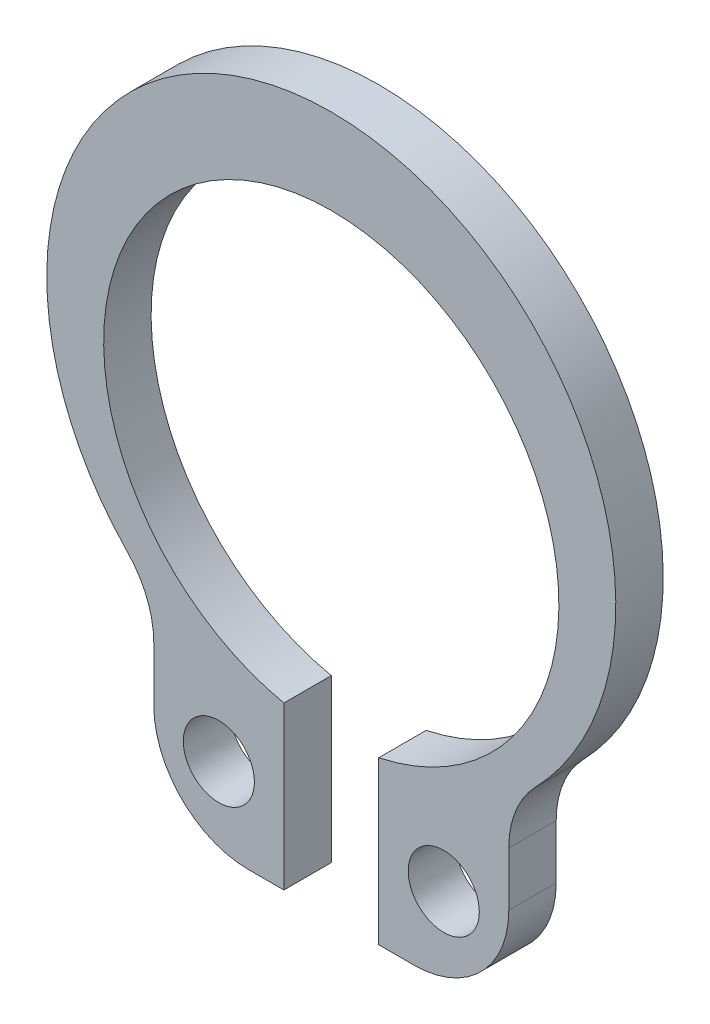
ISO-10303-21;
HEADER;
FILE_DESCRIPTION(('STEP AP214'),'2;1');
FILE_NAME('part.step','',(''),(''),'','','');
FILE_SCHEMA(('AUTOMOTIVE_DESIGN { 1 0 10303 214 1 1 1 1 }'));
ENDSEC;
DATA;
#1=APPLICATION_CONTEXT('core data for automotive mechanical design processes');
#2=APPLICATION_PROTOCOL_DEFINITION('international standard','automotive_design',2000,#1);
#3=PRODUCT_CONTEXT('',#1,'mechanical');
#4=PRODUCT('Part','Part','',(#3));
#5=PRODUCT_RELATED_PRODUCT_CATEGORY('part','',(#4));
#6=PRODUCT_DEFINITION_FORMATION('','',#4);
#7=PRODUCT_DEFINITION_CONTEXT('part definition',#1,'design');
#8=PRODUCT_DEFINITION('design','',#6,#7);
#9=PRODUCT_DEFINITION_SHAPE('','',#8);
#10=(LENGTH_UNIT() NAMED_UNIT(*) SI_UNIT(.MILLI.,.METRE.));
#11=(NAMED_UNIT(*) PLANE_ANGLE_UNIT() SI_UNIT($,.RADIAN.));
#12=(NAMED_UNIT(*) SI_UNIT($,.STERADIAN.) SOLID_ANGLE_UNIT());
#13=UNCERTAINTY_MEASURE_WITH_UNIT(LENGTH_MEASURE(1.E-05),#10,'distance_accuracy_value','');
#14=(GEOMETRIC_REPRESENTATION_CONTEXT(3) GLOBAL_UNCERTAINTY_ASSIGNED_CONTEXT((#13)) GLOBAL_UNIT_ASSIGNED_CONTEXT((#10,
#11,#12)) REPRESENTATION_CONTEXT('',''));
#15=CARTESIAN_POINT('',(0.,0.,0.));
#16=DIRECTION('',(0.,0.,1.));
#17=DIRECTION('',(1.,0.,0.));
#18=AXIS2_PLACEMENT_3D('',#15,#16,#17);
#19=CARTESIAN_POINT('',(-2.37160157380422,-6.45,0.5));
#20=DIRECTION('',(0.,0.,-1.));
#21=DIRECTION('',(1.,0.,0.));
#22=AXIS2_PLACEMENT_3D('',#19,#20,#21);
#23=CYLINDRICAL_SURFACE('',#22,0.75);
#24=CARTESIAN_POINT('',(-2.37160157380422,-6.45,0.));
#25=DIRECTION('',(0.,0.,1.));
#26=DIRECTION('',(1.,0.,0.));
#27=AXIS2_PLACEMENT_3D('',#24,#25,#26);
#28=CIRCLE('',#27,0.75);
#29=CARTESIAN_POINT('',(-1.62160157380422,-6.45,0.));
#30=VERTEX_POINT('',#29);
#31=EDGE_CURVE('E32',#30,#30,#28,.T.);
#32=ORIENTED_EDGE('',*,*,#31,.F.);
#33=EDGE_LOOP('',(#32));
#34=FACE_BOUND('',#33,.T.);
#35=CARTESIAN_POINT('',(-2.37160157380422,-6.45,1.));
#36=DIRECTION('',(0.,0.,-1.));
#37=DIRECTION('',(1.,0.,0.));
#38=AXIS2_PLACEMENT_3D('',#35,#36,#37);
#39=CIRCLE('',#38,0.75);
#40=CARTESIAN_POINT('',(-1.62160157380422,-6.45,1.));
#41=VERTEX_POINT('',#40);
#42=EDGE_CURVE('E204',#41,#41,#39,.T.);
#43=ORIENTED_EDGE('',*,*,#42,.F.);
#44=EDGE_LOOP('',(#43));
#45=FACE_BOUND('',#44,.T.);
#46=ADVANCED_FACE('F15',(#34,#45),#23,.F.);
#47=CARTESIAN_POINT('',(2.37160157380422,-6.45,0.5));
#48=DIRECTION('',(0.,0.,-1.));
#49=DIRECTION('',(1.,0.,0.));
#50=AXIS2_PLACEMENT_3D('',#47,#48,#49);
#51=CYLINDRICAL_SURFACE('',#50,0.75);
#52=CARTESIAN_POINT('',(2.37160157380422,-6.45,0.));
#53=DIRECTION('',(0.,0.,1.));
#54=DIRECTION('',(1.,0.,0.));
#55=AXIS2_PLACEMENT_3D('',#52,#53,#54);
#56=CIRCLE('',#55,0.75);
#57=CARTESIAN_POINT('',(3.12160157380422,-6.45,0.));
#58=VERTEX_POINT('',#57);
#59=EDGE_CURVE('E52',#58,#58,#56,.T.);
#60=ORIENTED_EDGE('',*,*,#59,.F.);
#61=EDGE_LOOP('',(#60));
#62=FACE_BOUND('',#61,.T.);
#63=CARTESIAN_POINT('',(2.37160157380422,-6.45,1.));
#64=DIRECTION('',(0.,0.,-1.));
#65=DIRECTION('',(1.,0.,0.));
#66=AXIS2_PLACEMENT_3D('',#63,#64,#65);
#67=CIRCLE('',#66,0.75);
#68=CARTESIAN_POINT('',(3.12160157380422,-6.45,1.));
#69=VERTEX_POINT('',#68);
#70=EDGE_CURVE('E58',#69,#69,#67,.T.);
#71=ORIENTED_EDGE('',*,*,#70,.F.);
#72=EDGE_LOOP('',(#71));
#73=FACE_BOUND('',#72,.T.);
#74=ADVANCED_FACE('F272',(#62,#73),#51,.F.);
#75=CARTESIAN_POINT('',(5.74320314760844,-4.96916668859,0.));
#76=DIRECTION('',(0.,0.,-1.));
#77=DIRECTION('',(1.,0.,0.));
#78=AXIS2_PLACEMENT_3D('',#75,#76,#77);
#79=CYLINDRICAL_SURFACE('',#78,2.);
#80=CARTESIAN_POINT('',(5.74320314760844,-4.96916668859,1.));
#81=DIRECTION('',(0.,0.,1.));
#82=DIRECTION('',(1.,0.,0.));
#83=AXIS2_PLACEMENT_3D('',#80,#81,#82);
#84=CIRCLE('',#83,2.);
#85=CARTESIAN_POINT('',(4.30740236070632,-3.5768750164425,1.));
#86=VERTEX_POINT('',#85);
#87=CARTESIAN_POINT('',(3.74320314760844,-4.96916668859,1.));
#88=VERTEX_POINT('',#87);
#89=EDGE_CURVE('E10',#86,#88,#84,.T.);
#90=ORIENTED_EDGE('',*,*,#89,.T.);
#91=DIRECTION('',(0.,0.,1.));
#92=VECTOR('',#91,1.);
#93=CARTESIAN_POINT('',(3.74320314760844,-4.96916668859,0.));
#94=LINE('',#93,#92);
#95=CARTESIAN_POINT('',(3.74320314760844,-4.96916668859,0.));
#96=VERTEX_POINT('',#95);
#97=EDGE_CURVE('E180',#96,#88,#94,.T.);
#98=ORIENTED_EDGE('',*,*,#97,.F.);
#99=CARTESIAN_POINT('',(5.74320314760844,-4.96916668859,0.));
#100=DIRECTION('',(0.,0.,1.));
#101=DIRECTION('',(1.,0.,0.));
#102=AXIS2_PLACEMENT_3D('',#99,#100,#101);
#103=CIRCLE('',#102,2.);
#104=CARTESIAN_POINT('',(4.30740236070632,-3.5768750164425,0.));
#105=VERTEX_POINT('',#104);
#106=EDGE_CURVE('E166',#105,#96,#103,.T.);
#107=ORIENTED_EDGE('',*,*,#106,.F.);
#108=DIRECTION('',(0.,0.,1.));
#109=VECTOR('',#108,1.);
#110=CARTESIAN_POINT('',(4.30740236070632,-3.5768750164425,0.));
#111=LINE('',#110,#109);
#112=EDGE_CURVE('E25',#105,#86,#111,.T.);
#113=ORIENTED_EDGE('',*,*,#112,.T.);
#114=EDGE_LOOP('',(#90,#98,#107,#113));
#115=FACE_BOUND('',#114,.T.);
#116=ADVANCED_FACE('F241',(#115),#79,.F.);
#117=CARTESIAN_POINT('',(3.74320314760844,-5.539583344295,0.));
#118=DIRECTION('',(1.,0.,0.));
#119=DIRECTION('',(0.,1.,0.));
#120=AXIS2_PLACEMENT_3D('',#117,#118,#119);
#121=PLANE('',#120);
#122=DIRECTION('',(0.,-1.,0.));
#123=VECTOR('',#122,1.);
#124=CARTESIAN_POINT('',(3.74320314760844,-6.11,1.));
#125=LINE('',#124,#123);
#126=CARTESIAN_POINT('',(3.74320314760844,-6.11,1.));
#127=VERTEX_POINT('',#126);
#128=EDGE_CURVE('E185',#88,#127,#125,.T.);
#129=ORIENTED_EDGE('',*,*,#128,.T.);
#130=DIRECTION('',(0.,0.,1.));
#131=VECTOR('',#130,1.);
#132=CARTESIAN_POINT('',(3.74320314760844,-6.11,0.));
#133=LINE('',#132,#131);
#134=CARTESIAN_POINT('',(3.74320314760844,-6.11,0.));
#135=VERTEX_POINT('',#134);
#136=EDGE_CURVE('E191',#135,#127,#133,.T.);
#137=ORIENTED_EDGE('',*,*,#136,.F.);
#138=DIRECTION('',(0.,1.,0.));
#139=VECTOR('',#138,1.);
#140=CARTESIAN_POINT('',(3.74320314760844,-6.11,0.));
#141=LINE('',#140,#139);
#142=EDGE_CURVE('E182',#135,#96,#141,.T.);
#143=ORIENTED_EDGE('',*,*,#142,.T.);
#144=ORIENTED_EDGE('',*,*,#97,.T.);
#145=EDGE_LOOP('',(#129,#137,#143,#144));
#146=FACE_BOUND('',#145,.T.);
#147=ADVANCED_FACE('F244',(#146),#121,.T.);
#148=CARTESIAN_POINT('',(1.74320314760844,-6.11,0.));
#149=DIRECTION('',(0.,0.,-1.));
#150=DIRECTION('',(1.,0.,0.));
#151=AXIS2_PLACEMENT_3D('',#148,#149,#150);
#152=CYLINDRICAL_SURFACE('',#151,2.);
#153=CARTESIAN_POINT('',(1.74320314760844,-6.11,1.));
#154=DIRECTION('',(0.,0.,-1.));
#155=DIRECTION('',(1.,0.,0.));
#156=AXIS2_PLACEMENT_3D('',#153,#154,#155);
#157=CIRCLE('',#156,2.);
#158=CARTESIAN_POINT('',(1.74320314760844,-8.11,1.));
#159=VERTEX_POINT('',#158);
#160=EDGE_CURVE('E183',#127,#159,#157,.T.);
#161=ORIENTED_EDGE('',*,*,#160,.T.);
#162=DIRECTION('',(0.,0.,1.));
#163=VECTOR('',#162,1.);
#164=CARTESIAN_POINT('',(1.74320314760844,-8.11,0.));
#165=LINE('',#164,#163);
#166=CARTESIAN_POINT('',(1.74320314760844,-8.11,0.));
#167=VERTEX_POINT('',#166);
#168=EDGE_CURVE('E161',#167,#159,#165,.T.);
#169=ORIENTED_EDGE('',*,*,#168,.F.);
#170=CARTESIAN_POINT('',(1.74320314760844,-6.11,0.));
#171=DIRECTION('',(0.,0.,1.));
#172=DIRECTION('',(1.,0.,0.));
#173=AXIS2_PLACEMENT_3D('',#170,#171,#172);
#174=CIRCLE('',#173,2.);
#175=EDGE_CURVE('E160',#167,#135,#174,.T.);
#176=ORIENTED_EDGE('',*,*,#175,.T.);
#177=ORIENTED_EDGE('',*,*,#136,.T.);
#178=EDGE_LOOP('',(#161,#169,#176,#177));
#179=FACE_BOUND('',#178,.T.);
#180=ADVANCED_FACE('F246',(#179),#152,.T.);
#181=CARTESIAN_POINT('',(1.37160157380422,-8.11,0.));
#182=DIRECTION('',(0.,-1.,0.));
#183=DIRECTION('',(1.,0.,0.));
#184=AXIS2_PLACEMENT_3D('',#181,#182,#183);
#185=PLANE('',#184);
#186=DIRECTION('',(-1.,0.,0.));
#187=VECTOR('',#186,1.);
#188=CARTESIAN_POINT('',(1.,-8.11,1.));
#189=LINE('',#188,#187);
#190=CARTESIAN_POINT('',(1.,-8.11,1.));
#191=VERTEX_POINT('',#190);
#192=EDGE_CURVE('E147',#159,#191,#189,.T.);
#193=ORIENTED_EDGE('',*,*,#192,.T.);
#194=DIRECTION('',(0.,0.,1.));
#195=VECTOR('',#194,1.);
#196=CARTESIAN_POINT('',(1.,-8.11,0.));
#197=LINE('',#196,#195);
#198=CARTESIAN_POINT('',(1.,-8.11,0.));
#199=VERTEX_POINT('',#198);
#200=EDGE_CURVE('E139',#199,#191,#197,.T.);
#201=ORIENTED_EDGE('',*,*,#200,.F.);
#202=DIRECTION('',(1.,0.,0.));
#203=VECTOR('',#202,1.);
#204=CARTESIAN_POINT('',(1.,-8.11,0.));
#205=LINE('',#204,#203);
#206=EDGE_CURVE('E145',#199,#167,#205,.T.);
#207=ORIENTED_EDGE('',*,*,#206,.T.);
#208=ORIENTED_EDGE('',*,*,#168,.T.);
#209=EDGE_LOOP('',(#193,#201,#207,#208));
#210=FACE_BOUND('',#209,.T.);
#211=ADVANCED_FACE('F144',(#210),#185,.T.);
#212=CARTESIAN_POINT('',(1.,-6.4023389188611,0.));
#213=DIRECTION('',(-1.,0.,0.));
#214=DIRECTION('',(0.,-1.,0.));
#215=AXIS2_PLACEMENT_3D('',#212,#213,#214);
#216=PLANE('',#215);
#217=DIRECTION('',(0.,1.,0.));
#218=VECTOR('',#217,1.);
#219=CARTESIAN_POINT('',(1.,-8.11,1.));
#220=LINE('',#219,#218);
#221=CARTESIAN_POINT('',(1.,-4.6946778377222,1.));
#222=VERTEX_POINT('',#221);
#223=EDGE_CURVE('E149',#191,#222,#220,.T.);
#224=ORIENTED_EDGE('',*,*,#223,.T.);
#225=DIRECTION('',(0.,0.,1.));
#226=VECTOR('',#225,1.);
#227=CARTESIAN_POINT('',(1.,-4.6946778377222,0.));
#228=LINE('',#227,#226);
#229=CARTESIAN_POINT('',(1.,-4.6946778377222,0.));
#230=VERTEX_POINT('',#229);
#231=EDGE_CURVE('E164',#230,#222,#228,.T.);
#232=ORIENTED_EDGE('',*,*,#231,.F.);
#233=DIRECTION('',(0.,1.,0.));
#234=VECTOR('',#233,1.);
#235=CARTESIAN_POINT('',(1.,-8.11,0.));
#236=LINE('',#235,#234);
#237=EDGE_CURVE('E156',#199,#230,#236,.T.);
#238=ORIENTED_EDGE('',*,*,#237,.F.);
#239=ORIENTED_EDGE('',*,*,#200,.T.);
#240=EDGE_LOOP('',(#224,#232,#238,#239));
#241=FACE_BOUND('',#240,.T.);
#242=ADVANCED_FACE('F163',(#241),#216,.T.);
#243=CARTESIAN_POINT('',(0.,0.,0.));
#244=DIRECTION('',(0.,0.,-1.));
#245=DIRECTION('',(1.,0.,0.));
#246=AXIS2_PLACEMENT_3D('',#243,#244,#245);
#247=CYLINDRICAL_SURFACE('',#246,4.8);
#248=CARTESIAN_POINT('',(0.,0.,1.));
#249=DIRECTION('',(0.,0.,1.));
#250=DIRECTION('',(1.,0.,0.));
#251=AXIS2_PLACEMENT_3D('',#248,#249,#250);
#252=CIRCLE('',#251,4.8);
#253=CARTESIAN_POINT('',(-1.,-4.6946778377222,1.));
#254=VERTEX_POINT('',#253);
#255=EDGE_CURVE('E150',#222,#254,#252,.T.);
#256=ORIENTED_EDGE('',*,*,#255,.T.);
#257=DIRECTION('',(0.,0.,1.));
#258=VECTOR('',#257,1.);
#259=CARTESIAN_POINT('',(-1.,-4.6946778377222,0.));
#260=LINE('',#259,#258);
#261=CARTESIAN_POINT('',(-1.,-4.6946778377222,0.));
#262=VERTEX_POINT('',#261);
#263=EDGE_CURVE('E195',#262,#254,#260,.T.);
#264=ORIENTED_EDGE('',*,*,#263,.F.);
#265=CARTESIAN_POINT('',(0.,0.,0.));
#266=DIRECTION('',(0.,0.,1.));
#267=DIRECTION('',(1.,0.,0.));
#268=AXIS2_PLACEMENT_3D('',#265,#266,#267);
#269=CIRCLE('',#268,4.8);
#270=EDGE_CURVE('E19',#230,#262,#269,.T.);
#271=ORIENTED_EDGE('',*,*,#270,.F.);
#272=ORIENTED_EDGE('',*,*,#231,.T.);
#273=EDGE_LOOP('',(#256,#264,#271,#272));
#274=FACE_BOUND('',#273,.T.);
#275=ADVANCED_FACE('F252',(#274),#247,.F.);
#276=CARTESIAN_POINT('',(-1.,-6.4023389188611,0.));
#277=DIRECTION('',(1.,0.,0.));
#278=DIRECTION('',(0.,1.,0.));
#279=AXIS2_PLACEMENT_3D('',#276,#277,#278);
#280=PLANE('',#279);
#281=DIRECTION('',(0.,-1.,0.));
#282=VECTOR('',#281,1.);
#283=CARTESIAN_POINT('',(-1.,-8.11,1.));
#284=LINE('',#283,#282);
#285=CARTESIAN_POINT('',(-1.,-8.11,1.));
#286=VERTEX_POINT('',#285);
#287=EDGE_CURVE('E174',#254,#286,#284,.T.);
#288=ORIENTED_EDGE('',*,*,#287,.T.);
#289=DIRECTION('',(0.,0.,1.));
#290=VECTOR('',#289,1.);
#291=CARTESIAN_POINT('',(-1.,-8.11,0.));
#292=LINE('',#291,#290);
#293=CARTESIAN_POINT('',(-1.,-8.11,0.));
#294=VERTEX_POINT('',#293);
#295=EDGE_CURVE('E199',#294,#286,#292,.T.);
#296=ORIENTED_EDGE('',*,*,#295,.F.);
#297=DIRECTION('',(0.,1.,0.));
#298=VECTOR('',#297,1.);
#299=CARTESIAN_POINT('',(-1.,-8.11,0.));
#300=LINE('',#299,#298);
#301=EDGE_CURVE('E192',#294,#262,#300,.T.);
#302=ORIENTED_EDGE('',*,*,#301,.T.);
#303=ORIENTED_EDGE('',*,*,#263,.T.);
#304=EDGE_LOOP('',(#288,#296,#302,#303));
#305=FACE_BOUND('',#304,.T.);
#306=ADVANCED_FACE('F257',(#305),#280,.T.);
#307=CARTESIAN_POINT('',(-1.37160157380422,-8.11,0.));
#308=DIRECTION('',(0.,-1.,0.));
#309=DIRECTION('',(1.,0.,0.));
#310=AXIS2_PLACEMENT_3D('',#307,#308,#309);
#311=PLANE('',#310);
#312=DIRECTION('',(-1.,0.,0.));
#313=VECTOR('',#312,1.);
#314=CARTESIAN_POINT('',(-1.74320314760844,-8.11,1.));
#315=LINE('',#314,#313);
#316=CARTESIAN_POINT('',(-1.74320314760844,-8.11,1.));
#317=VERTEX_POINT('',#316);
#318=EDGE_CURVE('E171',#286,#317,#315,.T.);
#319=ORIENTED_EDGE('',*,*,#318,.T.);
#320=DIRECTION('',(0.,0.,1.));
#321=VECTOR('',#320,1.);
#322=CARTESIAN_POINT('',(-1.74320314760844,-8.11,0.));
#323=LINE('',#322,#321);
#324=CARTESIAN_POINT('',(-1.74320314760844,-8.11,0.));
#325=VERTEX_POINT('',#324);
#326=EDGE_CURVE('E112',#325,#317,#323,.T.);
#327=ORIENTED_EDGE('',*,*,#326,.F.);
#328=DIRECTION('',(1.,0.,0.));
#329=VECTOR('',#328,1.);
#330=CARTESIAN_POINT('',(-1.74320314760844,-8.11,0.));
#331=LINE('',#330,#329);
#332=EDGE_CURVE('E197',#325,#294,#331,.T.);
#333=ORIENTED_EDGE('',*,*,#332,.T.);
#334=ORIENTED_EDGE('',*,*,#295,.T.);
#335=EDGE_LOOP('',(#319,#327,#333,#334));
#336=FACE_BOUND('',#335,.T.);
#337=ADVANCED_FACE('F255',(#336),#311,.T.);
#338=CARTESIAN_POINT('',(-1.74320314760844,-6.11,0.));
#339=DIRECTION('',(0.,0.,-1.));
#340=DIRECTION('',(1.,0.,0.));
#341=AXIS2_PLACEMENT_3D('',#338,#339,#340);
#342=CYLINDRICAL_SURFACE('',#341,2.);
#343=CARTESIAN_POINT('',(-1.74320314760844,-6.11,1.));
#344=DIRECTION('',(0.,0.,-1.));
#345=DIRECTION('',(1.,0.,0.));
#346=AXIS2_PLACEMENT_3D('',#343,#344,#345);
#347=CIRCLE('',#346,2.);
#348=CARTESIAN_POINT('',(-3.74320314760844,-6.11,1.));
#349=VERTEX_POINT('',#348);
#350=EDGE_CURVE('E177',#317,#349,#347,.T.);
#351=ORIENTED_EDGE('',*,*,#350,.T.);
#352=DIRECTION('',(0.,0.,1.));
#353=VECTOR('',#352,1.);
#354=CARTESIAN_POINT('',(-3.74320314760844,-6.11,0.));
#355=LINE('',#354,#353);
#356=CARTESIAN_POINT('',(-3.74320314760844,-6.11,0.));
#357=VERTEX_POINT('',#356);
#358=EDGE_CURVE('E116',#357,#349,#355,.T.);
#359=ORIENTED_EDGE('',*,*,#358,.F.);
#360=CARTESIAN_POINT('',(-1.74320314760844,-6.11,0.));
#361=DIRECTION('',(0.,0.,1.));
#362=DIRECTION('',(1.,0.,0.));
#363=AXIS2_PLACEMENT_3D('',#360,#361,#362);
#364=CIRCLE('',#363,2.);
#365=EDGE_CURVE('E175',#357,#325,#364,.T.);
#366=ORIENTED_EDGE('',*,*,#365,.T.);
#367=ORIENTED_EDGE('',*,*,#326,.T.);
#368=EDGE_LOOP('',(#351,#359,#366,#367));
#369=FACE_BOUND('',#368,.T.);
#370=ADVANCED_FACE('F258',(#369),#342,.T.);
#371=CARTESIAN_POINT('',(-3.74320314760844,-5.539583344295,0.));
#372=DIRECTION('',(-1.,0.,0.));
#373=DIRECTION('',(0.,-1.,0.));
#374=AXIS2_PLACEMENT_3D('',#371,#372,#373);
#375=PLANE('',#374);
#376=DIRECTION('',(0.,1.,0.));
#377=VECTOR('',#376,1.);
#378=CARTESIAN_POINT('',(-3.74320314760844,-4.96916668859,1.));
#379=LINE('',#378,#377);
#380=CARTESIAN_POINT('',(-3.74320314760844,-4.96916668859,1.));
#381=VERTEX_POINT('',#380);
#382=EDGE_CURVE('E206',#349,#381,#379,.T.);
#383=ORIENTED_EDGE('',*,*,#382,.T.);
#384=DIRECTION('',(0.,0.,1.));
#385=VECTOR('',#384,1.);
#386=CARTESIAN_POINT('',(-3.74320314760844,-4.96916668859,0.));
#387=LINE('',#386,#385);
#388=CARTESIAN_POINT('',(-3.74320314760844,-4.96916668859,0.));
#389=VERTEX_POINT('',#388);
#390=EDGE_CURVE('E101',#389,#381,#387,.T.);
#391=ORIENTED_EDGE('',*,*,#390,.F.);
#392=DIRECTION('',(0.,-1.,0.));
#393=VECTOR('',#392,1.);
#394=CARTESIAN_POINT('',(-3.74320314760844,-4.96916668859,0.));
#395=LINE('',#394,#393);
#396=EDGE_CURVE('E207',#389,#357,#395,.T.);
#397=ORIENTED_EDGE('',*,*,#396,.T.);
#398=ORIENTED_EDGE('',*,*,#358,.T.);
#399=EDGE_LOOP('',(#383,#391,#397,#398));
#400=FACE_BOUND('',#399,.T.);
#401=ADVANCED_FACE('F260',(#400),#375,.T.);
#402=CARTESIAN_POINT('',(-5.74320314760844,-4.96916668859,0.));
#403=DIRECTION('',(0.,0.,-1.));
#404=DIRECTION('',(1.,0.,0.));
#405=AXIS2_PLACEMENT_3D('',#402,#403,#404);
#406=CYLINDRICAL_SURFACE('',#405,2.);
#407=CARTESIAN_POINT('',(-5.74320314760844,-4.96916668859,1.));
#408=DIRECTION('',(0.,0.,1.));
#409=DIRECTION('',(1.,0.,0.));
#410=AXIS2_PLACEMENT_3D('',#407,#408,#409);
#411=CIRCLE('',#410,2.);
#412=CARTESIAN_POINT('',(-4.30740236070633,-3.5768750164425,1.));
#413=VERTEX_POINT('',#412);
#414=EDGE_CURVE('E186',#381,#413,#411,.T.);
#415=ORIENTED_EDGE('',*,*,#414,.T.);
#416=DIRECTION('',(0.,0.,1.));
#417=VECTOR('',#416,1.);
#418=CARTESIAN_POINT('',(-4.30740236070633,-3.5768750164425,0.));
#419=LINE('',#418,#417);
#420=CARTESIAN_POINT('',(-4.30740236070633,-3.5768750164425,0.));
#421=VERTEX_POINT('',#420);
#422=EDGE_CURVE('E93',#421,#413,#419,.T.);
#423=ORIENTED_EDGE('',*,*,#422,.F.);
#424=CARTESIAN_POINT('',(-5.74320314760844,-4.96916668859,0.));
#425=DIRECTION('',(0.,0.,1.));
#426=DIRECTION('',(1.,0.,0.));
#427=AXIS2_PLACEMENT_3D('',#424,#425,#426);
#428=CIRCLE('',#427,2.);
#429=EDGE_CURVE('E168',#389,#421,#428,.T.);
#430=ORIENTED_EDGE('',*,*,#429,.F.);
#431=ORIENTED_EDGE('',*,*,#390,.T.);
#432=EDGE_LOOP('',(#415,#423,#430,#431));
#433=FACE_BOUND('',#432,.T.);
#434=ADVANCED_FACE('F234',(#433),#406,.F.);
#435=CARTESIAN_POINT('',(0.,0.6,0.));
#436=DIRECTION('',(0.,0.,-1.));
#437=DIRECTION('',(1.,0.,0.));
#438=AXIS2_PLACEMENT_3D('',#435,#436,#437);
#439=CYLINDRICAL_SURFACE('',#438,6.);
#440=CARTESIAN_POINT('',(0.,0.6,1.));
#441=DIRECTION('',(0.,0.,-1.));
#442=DIRECTION('',(1.,0.,0.));
#443=AXIS2_PLACEMENT_3D('',#440,#441,#442);
#444=CIRCLE('',#443,6.);
#445=EDGE_CURVE('E200',#413,#86,#444,.T.);
#446=ORIENTED_EDGE('',*,*,#445,.T.);
#447=ORIENTED_EDGE('',*,*,#112,.F.);
#448=CARTESIAN_POINT('',(0.,0.6,0.));
#449=DIRECTION('',(0.,0.,1.));
#450=DIRECTION('',(1.,0.,0.));
#451=AXIS2_PLACEMENT_3D('',#448,#449,#450);
#452=CIRCLE('',#451,6.);
#453=EDGE_CURVE('E203',#105,#421,#452,.T.);
#454=ORIENTED_EDGE('',*,*,#453,.T.);
#455=ORIENTED_EDGE('',*,*,#422,.T.);
#456=EDGE_LOOP('',(#446,#447,#454,#455));
#457=FACE_BOUND('',#456,.T.);
#458=ADVANCED_FACE('F230',(#457),#439,.T.);
#459=CARTESIAN_POINT('',(0.,-1.0358146731018,1.));
#460=DIRECTION('',(0.,0.,1.));
#461=DIRECTION('',(1.,0.,0.));
#462=AXIS2_PLACEMENT_3D('',#459,#460,#461);
#463=PLANE('',#462);
#464=ORIENTED_EDGE('',*,*,#42,.T.);
#465=EDGE_LOOP('',(#464));
#466=FACE_BOUND('',#465,.T.);
#467=ORIENTED_EDGE('',*,*,#70,.T.);
#468=EDGE_LOOP('',(#467));
#469=FACE_BOUND('',#468,.T.);
#470=ORIENTED_EDGE('',*,*,#89,.F.);
#471=ORIENTED_EDGE('',*,*,#445,.F.);
#472=ORIENTED_EDGE('',*,*,#414,.F.);
#473=ORIENTED_EDGE('',*,*,#382,.F.);
#474=ORIENTED_EDGE('',*,*,#350,.F.);
#475=ORIENTED_EDGE('',*,*,#318,.F.);
#476=ORIENTED_EDGE('',*,*,#287,.F.);
#477=ORIENTED_EDGE('',*,*,#255,.F.);
#478=ORIENTED_EDGE('',*,*,#223,.F.);
#479=ORIENTED_EDGE('',*,*,#192,.F.);
#480=ORIENTED_EDGE('',*,*,#160,.F.);
#481=ORIENTED_EDGE('',*,*,#128,.F.);
#482=EDGE_LOOP('',(#470,#471,#472,#473,#474,#475,#476,#477,#478,#479,#480,#481));
#483=FACE_BOUND('',#482,.T.);
#484=ADVANCED_FACE('F17',(#466,#469,#483),#463,.T.);
#485=CARTESIAN_POINT('',(0.,-1.0358146731018,0.));
#486=DIRECTION('',(0.,0.,1.));
#487=DIRECTION('',(1.,0.,0.));
#488=AXIS2_PLACEMENT_3D('',#485,#486,#487);
#489=PLANE('',#488);
#490=ORIENTED_EDGE('',*,*,#31,.T.);
#491=EDGE_LOOP('',(#490));
#492=FACE_BOUND('',#491,.T.);
#493=ORIENTED_EDGE('',*,*,#59,.T.);
#494=EDGE_LOOP('',(#493));
#495=FACE_BOUND('',#494,.T.);
#496=ORIENTED_EDGE('',*,*,#453,.F.);
#497=ORIENTED_EDGE('',*,*,#106,.T.);
#498=ORIENTED_EDGE('',*,*,#142,.F.);
#499=ORIENTED_EDGE('',*,*,#175,.F.);
#500=ORIENTED_EDGE('',*,*,#206,.F.);
#501=ORIENTED_EDGE('',*,*,#237,.T.);
#502=ORIENTED_EDGE('',*,*,#270,.T.);
#503=ORIENTED_EDGE('',*,*,#301,.F.);
#504=ORIENTED_EDGE('',*,*,#332,.F.);
#505=ORIENTED_EDGE('',*,*,#365,.F.);
#506=ORIENTED_EDGE('',*,*,#396,.F.);
#507=ORIENTED_EDGE('',*,*,#429,.T.);
#508=EDGE_LOOP('',(#496,#497,#498,#499,#500,#501,#502,#503,#504,#505,#506,#507));
#509=FACE_BOUND('',#508,.T.);
#510=ADVANCED_FACE('F155',(#492,#495,#509),#489,.F.);
#511=CLOSED_SHELL('',(#46,#74,#116,#147,#180,#211,#242,#275,#306,#337,#370,#401,#434,#458,#484,#510));
#512=MANIFOLD_SOLID_BREP('B1',#511);
#513=ADVANCED_BREP_SHAPE_REPRESENTATION('',(#18,#512),#14);
#514=SHAPE_DEFINITION_REPRESENTATION(#9,#513);
ENDSEC;
END-ISO-10303-21;
